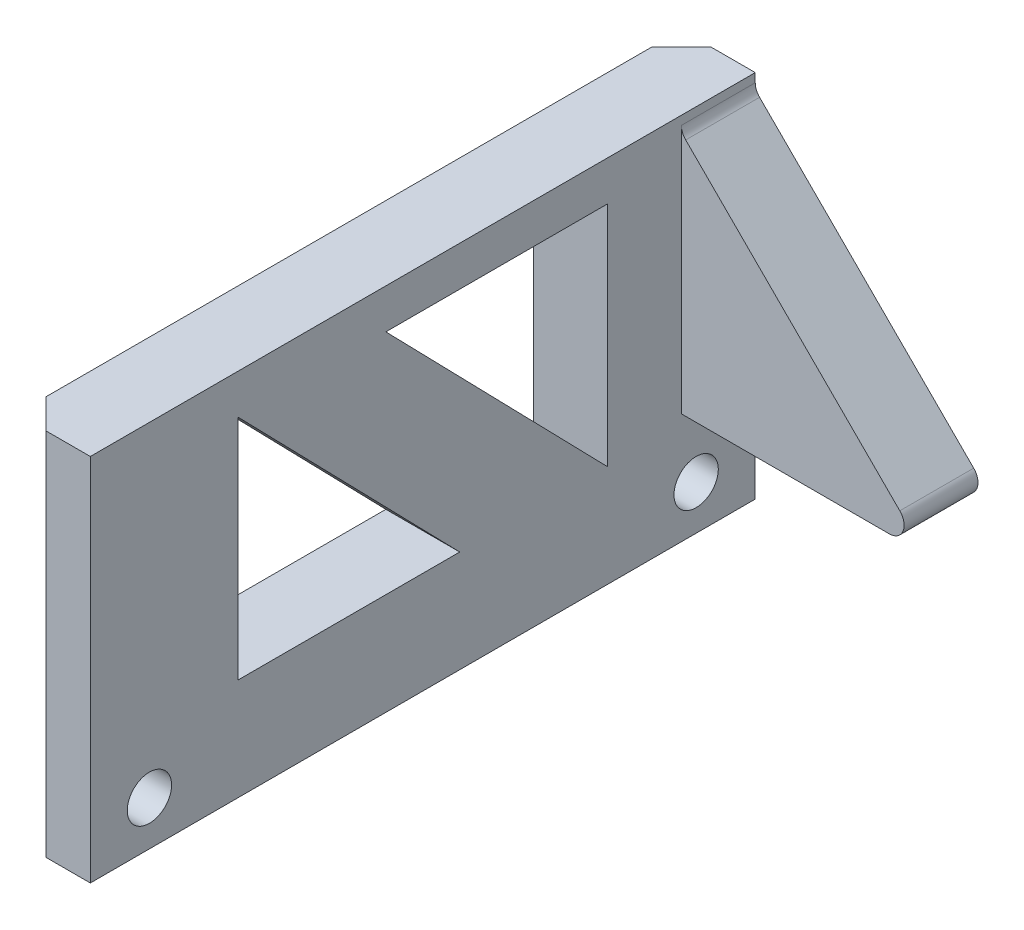
ISO-10303-21;
HEADER;
FILE_DESCRIPTION(('STEP AP214'),'2;1');
FILE_NAME('part.step','',(''),(''),'','','');
FILE_SCHEMA(('AUTOMOTIVE_DESIGN { 1 0 10303 214 1 1 1 1 }'));
ENDSEC;
DATA;
#1=APPLICATION_CONTEXT('core data for automotive mechanical design processes');
#2=APPLICATION_PROTOCOL_DEFINITION('international standard','automotive_design',2000,#1);
#3=PRODUCT_CONTEXT('',#1,'mechanical');
#4=PRODUCT('Part','Part','',(#3));
#5=PRODUCT_RELATED_PRODUCT_CATEGORY('part','',(#4));
#6=PRODUCT_DEFINITION_FORMATION('','',#4);
#7=PRODUCT_DEFINITION_CONTEXT('part definition',#1,'design');
#8=PRODUCT_DEFINITION('design','',#6,#7);
#9=PRODUCT_DEFINITION_SHAPE('','',#8);
#10=(LENGTH_UNIT() NAMED_UNIT(*) SI_UNIT(.MILLI.,.METRE.));
#11=(NAMED_UNIT(*) PLANE_ANGLE_UNIT() SI_UNIT($,.RADIAN.));
#12=(NAMED_UNIT(*) SI_UNIT($,.STERADIAN.) SOLID_ANGLE_UNIT());
#13=UNCERTAINTY_MEASURE_WITH_UNIT(LENGTH_MEASURE(1.E-05),#10,'distance_accuracy_value','');
#14=(GEOMETRIC_REPRESENTATION_CONTEXT(3) GLOBAL_UNCERTAINTY_ASSIGNED_CONTEXT((#13)) GLOBAL_UNIT_ASSIGNED_CONTEXT((#10,
#11,#12)) REPRESENTATION_CONTEXT('',''));
#15=CARTESIAN_POINT('',(0.,0.,0.));
#16=DIRECTION('',(0.,0.,1.));
#17=DIRECTION('',(1.,0.,0.));
#18=AXIS2_PLACEMENT_3D('',#15,#16,#17);
#19=CARTESIAN_POINT('',(5.,12.5,-22.5));
#20=DIRECTION('',(0.,0.,1.));
#21=DIRECTION('',(1.,0.,0.));
#22=AXIS2_PLACEMENT_3D('',#19,#20,#21);
#23=PLANE('',#22);
#24=DIRECTION('',(0.707106781186551,-0.707106781186544,0.));
#25=VECTOR('',#24,1.);
#26=CARTESIAN_POINT('',(21.4902925852937,-5.,-22.5));
#27=LINE('',#26,#25);
#28=CARTESIAN_POINT('',(5.29289321881346,11.1973993664801,-22.5));
#29=VERTEX_POINT('',#28);
#30=CARTESIAN_POINT('',(19.7831858041071,-3.29289321881345,-22.5));
#31=VERTEX_POINT('',#30);
#32=EDGE_CURVE('E356',#29,#31,#27,.T.);
#33=ORIENTED_EDGE('',*,*,#32,.T.);
#34=CARTESIAN_POINT('',(19.0760790229206,-4.,-22.5));
#35=DIRECTION('',(0.,0.,1.));
#36=DIRECTION('',(1.,0.,0.));
#37=AXIS2_PLACEMENT_3D('',#34,#35,#36);
#38=CIRCLE('',#37,1.);
#39=CARTESIAN_POINT('',(19.0760790229206,-5.,-22.5));
#40=VERTEX_POINT('',#39);
#41=EDGE_CURVE('E344',#31,#40,#38,.F.);
#42=ORIENTED_EDGE('',*,*,#41,.T.);
#43=DIRECTION('',(-1.,0.,0.));
#44=VECTOR('',#43,1.);
#45=CARTESIAN_POINT('',(5.,-5.,-22.5));
#46=LINE('',#45,#44);
#47=CARTESIAN_POINT('',(5.,-5.,-22.5));
#48=VERTEX_POINT('',#47);
#49=EDGE_CURVE('E181',#40,#48,#46,.T.);
#50=ORIENTED_EDGE('',*,*,#49,.T.);
#51=DIRECTION('',(0.,1.,0.));
#52=VECTOR('',#51,1.);
#53=CARTESIAN_POINT('',(5.,12.5,-22.5));
#54=LINE('',#53,#52);
#55=CARTESIAN_POINT('',(5.,-12.5,-22.5));
#56=VERTEX_POINT('',#55);
#57=EDGE_CURVE('E187',#56,#48,#54,.T.);
#58=ORIENTED_EDGE('',*,*,#57,.F.);
#59=DIRECTION('',(-1.,0.,0.));
#60=VECTOR('',#59,1.);
#61=CARTESIAN_POINT('',(5.,-12.5,-22.5));
#62=LINE('',#61,#60);
#63=CARTESIAN_POINT('',(2.,-12.5,-22.5));
#64=VERTEX_POINT('',#63);
#65=EDGE_CURVE('E290',#56,#64,#62,.T.);
#66=ORIENTED_EDGE('',*,*,#65,.T.);
#67=DIRECTION('',(0.,1.,0.));
#68=VECTOR('',#67,1.);
#69=CARTESIAN_POINT('',(2.,12.5,-22.5));
#70=LINE('',#69,#68);
#71=CARTESIAN_POINT('',(2.,12.5,-22.5));
#72=VERTEX_POINT('',#71);
#73=EDGE_CURVE('E335',#64,#72,#70,.T.);
#74=ORIENTED_EDGE('',*,*,#73,.T.);
#75=DIRECTION('',(-1.,0.,0.));
#76=VECTOR('',#75,1.);
#77=CARTESIAN_POINT('',(5.,12.5,-22.5));
#78=LINE('',#77,#76);
#79=CARTESIAN_POINT('',(5.,12.5,-22.5));
#80=VERTEX_POINT('',#79);
#81=EDGE_CURVE('E306',#80,#72,#78,.T.);
#82=ORIENTED_EDGE('',*,*,#81,.F.);
#83=CARTESIAN_POINT('',(5.,11.9045061476666,-22.5));
#84=VERTEX_POINT('',#83);
#85=EDGE_CURVE('E279',#84,#80,#54,.T.);
#86=ORIENTED_EDGE('',*,*,#85,.F.);
#87=CARTESIAN_POINT('',(6.,11.9045061476666,-22.5));
#88=DIRECTION('',(0.,0.,1.));
#89=DIRECTION('',(1.,0.,0.));
#90=AXIS2_PLACEMENT_3D('',#87,#88,#89);
#91=CIRCLE('',#90,1.);
#92=EDGE_CURVE('E57',#84,#29,#91,.T.);
#93=ORIENTED_EDGE('',*,*,#92,.T.);
#94=EDGE_LOOP('',(#33,#42,#50,#58,#66,#74,#82,#86,#93));
#95=FACE_BOUND('',#94,.T.);
#96=ADVANCED_FACE('F50',(#95),#23,.F.);
#97=CARTESIAN_POINT('',(5.,12.5,22.5));
#98=DIRECTION('',(0.,-1.,0.));
#99=DIRECTION('',(0.,0.,-1.));
#100=AXIS2_PLACEMENT_3D('',#97,#98,#99);
#101=PLANE('',#100);
#102=DIRECTION('',(0.,0.,1.));
#103=VECTOR('',#102,1.);
#104=CARTESIAN_POINT('',(0.,12.5,22.5));
#105=LINE('',#104,#103);
#106=CARTESIAN_POINT('',(0.,12.5,-20.5));
#107=VERTEX_POINT('',#106);
#108=CARTESIAN_POINT('',(0.,12.5,20.5));
#109=VERTEX_POINT('',#108);
#110=EDGE_CURVE('E263',#107,#109,#105,.T.);
#111=ORIENTED_EDGE('',*,*,#110,.T.);
#112=DIRECTION('',(-0.707106781186546,0.,-0.707106781186549));
#113=VECTOR('',#112,1.);
#114=CARTESIAN_POINT('',(2.,12.5,22.5));
#115=LINE('',#114,#113);
#116=CARTESIAN_POINT('',(2.,12.5,22.5));
#117=VERTEX_POINT('',#116);
#118=EDGE_CURVE('E329',#109,#117,#115,.F.);
#119=ORIENTED_EDGE('',*,*,#118,.T.);
#120=DIRECTION('',(-1.,0.,0.));
#121=VECTOR('',#120,1.);
#122=CARTESIAN_POINT('',(5.,12.5,22.5));
#123=LINE('',#122,#121);
#124=CARTESIAN_POINT('',(5.,12.5,22.5));
#125=VERTEX_POINT('',#124);
#126=EDGE_CURVE('E305',#125,#117,#123,.T.);
#127=ORIENTED_EDGE('',*,*,#126,.F.);
#128=DIRECTION('',(0.,0.,1.));
#129=VECTOR('',#128,1.);
#130=CARTESIAN_POINT('',(5.,12.5,22.5));
#131=LINE('',#130,#129);
#132=EDGE_CURVE('E280',#80,#125,#131,.T.);
#133=ORIENTED_EDGE('',*,*,#132,.F.);
#134=ORIENTED_EDGE('',*,*,#81,.T.);
#135=DIRECTION('',(0.707106781186546,0.,-0.707106781186549));
#136=VECTOR('',#135,1.);
#137=CARTESIAN_POINT('',(2.,12.5,-22.5));
#138=LINE('',#137,#136);
#139=EDGE_CURVE('E327',#72,#107,#138,.F.);
#140=ORIENTED_EDGE('',*,*,#139,.T.);
#141=EDGE_LOOP('',(#111,#119,#127,#133,#134,#140));
#142=FACE_BOUND('',#141,.T.);
#143=ADVANCED_FACE('F371',(#142),#101,.F.);
#144=CARTESIAN_POINT('',(5.,12.5,22.5));
#145=DIRECTION('',(0.,0.,-1.));
#146=DIRECTION('',(-1.,0.,0.));
#147=AXIS2_PLACEMENT_3D('',#144,#145,#146);
#148=PLANE('',#147);
#149=ORIENTED_EDGE('',*,*,#126,.T.);
#150=DIRECTION('',(0.,-1.,0.));
#151=VECTOR('',#150,1.);
#152=CARTESIAN_POINT('',(2.,12.5,22.5));
#153=LINE('',#152,#151);
#154=CARTESIAN_POINT('',(2.,-12.5,22.5));
#155=VERTEX_POINT('',#154);
#156=EDGE_CURVE('E309',#117,#155,#153,.T.);
#157=ORIENTED_EDGE('',*,*,#156,.T.);
#158=DIRECTION('',(-1.,0.,0.));
#159=VECTOR('',#158,1.);
#160=CARTESIAN_POINT('',(5.,-12.5,22.5));
#161=LINE('',#160,#159);
#162=CARTESIAN_POINT('',(5.,-12.5,22.5));
#163=VERTEX_POINT('',#162);
#164=EDGE_CURVE('E296',#163,#155,#161,.T.);
#165=ORIENTED_EDGE('',*,*,#164,.F.);
#166=DIRECTION('',(0.,-1.,0.));
#167=VECTOR('',#166,1.);
#168=CARTESIAN_POINT('',(5.,12.5,22.5));
#169=LINE('',#168,#167);
#170=EDGE_CURVE('E282',#125,#163,#169,.T.);
#171=ORIENTED_EDGE('',*,*,#170,.F.);
#172=EDGE_LOOP('',(#149,#157,#165,#171));
#173=FACE_BOUND('',#172,.T.);
#174=ADVANCED_FACE('F386',(#173),#148,.F.);
#175=CARTESIAN_POINT('',(5.,-12.5,22.5));
#176=DIRECTION('',(0.,1.,0.));
#177=DIRECTION('',(0.,0.,1.));
#178=AXIS2_PLACEMENT_3D('',#175,#176,#177);
#179=PLANE('',#178);
#180=ORIENTED_EDGE('',*,*,#164,.T.);
#181=DIRECTION('',(0.707106781186546,0.,0.707106781186549));
#182=VECTOR('',#181,1.);
#183=CARTESIAN_POINT('',(2.,-12.5,22.5));
#184=LINE('',#183,#182);
#185=CARTESIAN_POINT('',(0.,-12.5,20.5));
#186=VERTEX_POINT('',#185);
#187=EDGE_CURVE('E320',#155,#186,#184,.F.);
#188=ORIENTED_EDGE('',*,*,#187,.T.);
#189=DIRECTION('',(0.,0.,-1.));
#190=VECTOR('',#189,1.);
#191=CARTESIAN_POINT('',(0.,-12.5,22.5));
#192=LINE('',#191,#190);
#193=CARTESIAN_POINT('',(0.,-12.5,-20.5));
#194=VERTEX_POINT('',#193);
#195=EDGE_CURVE('E293',#186,#194,#192,.T.);
#196=ORIENTED_EDGE('',*,*,#195,.T.);
#197=DIRECTION('',(-0.707106781186546,0.,0.707106781186549));
#198=VECTOR('',#197,1.);
#199=CARTESIAN_POINT('',(2.,-12.5,-22.5));
#200=LINE('',#199,#198);
#201=EDGE_CURVE('E313',#194,#64,#200,.F.);
#202=ORIENTED_EDGE('',*,*,#201,.T.);
#203=ORIENTED_EDGE('',*,*,#65,.F.);
#204=DIRECTION('',(0.,0.,-1.));
#205=VECTOR('',#204,1.);
#206=CARTESIAN_POINT('',(5.,-12.5,22.5));
#207=LINE('',#206,#205);
#208=EDGE_CURVE('E284',#163,#56,#207,.T.);
#209=ORIENTED_EDGE('',*,*,#208,.F.);
#210=EDGE_LOOP('',(#180,#188,#196,#202,#203,#209));
#211=FACE_BOUND('',#210,.T.);
#212=ADVANCED_FACE('F393',(#211),#179,.F.);
#213=CARTESIAN_POINT('',(5.,0.,0.));
#214=DIRECTION('',(1.,0.,0.));
#215=DIRECTION('',(0.,0.,-1.));
#216=AXIS2_PLACEMENT_3D('',#213,#214,#215);
#217=PLANE('',#216);
#218=DIRECTION('',(0.,1.,0.));
#219=VECTOR('',#218,1.);
#220=CARTESIAN_POINT('',(5.,11.4902925852935,-17.5));
#221=LINE('',#220,#219);
#222=CARTESIAN_POINT('',(5.,-5.,-17.5));
#223=VERTEX_POINT('',#222);
#224=CARTESIAN_POINT('',(5.,11.9045061476666,-17.5));
#225=VERTEX_POINT('',#224);
#226=EDGE_CURVE('E64',#223,#225,#221,.T.);
#227=ORIENTED_EDGE('',*,*,#226,.T.);
#228=DIRECTION('',(0.,0.,-1.));
#229=VECTOR('',#228,1.);
#230=CARTESIAN_POINT('',(5.,11.9045061476666,-22.5));
#231=LINE('',#230,#229);
#232=EDGE_CURVE('E353',#225,#84,#231,.T.);
#233=ORIENTED_EDGE('',*,*,#232,.T.);
#234=ORIENTED_EDGE('',*,*,#85,.T.);
#235=ORIENTED_EDGE('',*,*,#132,.T.);
#236=ORIENTED_EDGE('',*,*,#170,.T.);
#237=ORIENTED_EDGE('',*,*,#208,.T.);
#238=ORIENTED_EDGE('',*,*,#57,.T.);
#239=DIRECTION('',(0.,0.,-1.));
#240=VECTOR('',#239,1.);
#241=CARTESIAN_POINT('',(5.,-5.,-17.5));
#242=LINE('',#241,#240);
#243=EDGE_CURVE('E169',#223,#48,#242,.T.);
#244=ORIENTED_EDGE('',*,*,#243,.F.);
#245=EDGE_LOOP('',(#227,#233,#234,#235,#236,#237,#238,#244));
#246=FACE_BOUND('',#245,.T.);
#247=DIRECTION('',(0.,-0.716418791651359,-0.697670491685585));
#248=VECTOR('',#247,1.);
#249=CARTESIAN_POINT('',(5.,-5.59947650810714,-12.5));
#250=LINE('',#249,#248);
#251=CARTESIAN_POINT('',(5.,9.80361420998697,2.5));
#252=VERTEX_POINT('',#251);
#253=CARTESIAN_POINT('',(5.,-5.59947650810714,-12.5));
#254=VERTEX_POINT('',#253);
#255=EDGE_CURVE('E211',#252,#254,#250,.T.);
#256=ORIENTED_EDGE('',*,*,#255,.F.);
#257=DIRECTION('',(0.,0.,1.));
#258=VECTOR('',#257,1.);
#259=CARTESIAN_POINT('',(5.,9.80361420998697,2.5));
#260=LINE('',#259,#258);
#261=CARTESIAN_POINT('',(5.,9.80361420998697,-12.5));
#262=VERTEX_POINT('',#261);
#263=EDGE_CURVE('E204',#262,#252,#260,.T.);
#264=ORIENTED_EDGE('',*,*,#263,.F.);
#265=DIRECTION('',(0.,1.,0.));
#266=VECTOR('',#265,1.);
#267=CARTESIAN_POINT('',(5.,9.80361420998697,-12.5));
#268=LINE('',#267,#266);
#269=EDGE_CURVE('E209',#254,#262,#268,.T.);
#270=ORIENTED_EDGE('',*,*,#269,.F.);
#271=EDGE_LOOP('',(#256,#264,#270));
#272=FACE_BOUND('',#271,.T.);
#273=DIRECTION('',(0.,0.716418791651359,0.697670491685585));
#274=VECTOR('',#273,1.);
#275=CARTESIAN_POINT('',(5.,-5.59947650810714,-2.5));
#276=LINE('',#275,#274);
#277=CARTESIAN_POINT('',(5.,-5.59947650810714,-2.5));
#278=VERTEX_POINT('',#277);
#279=CARTESIAN_POINT('',(5.,9.80361420998697,12.5));
#280=VERTEX_POINT('',#279);
#281=EDGE_CURVE('E220',#278,#280,#276,.T.);
#282=ORIENTED_EDGE('',*,*,#281,.F.);
#283=DIRECTION('',(0.,0.,-1.));
#284=VECTOR('',#283,1.);
#285=CARTESIAN_POINT('',(5.,-5.59947650810714,12.5));
#286=LINE('',#285,#284);
#287=CARTESIAN_POINT('',(5.,-5.59947650810714,12.5));
#288=VERTEX_POINT('',#287);
#289=EDGE_CURVE('E231',#288,#278,#286,.T.);
#290=ORIENTED_EDGE('',*,*,#289,.F.);
#291=DIRECTION('',(0.,-1.,0.));
#292=VECTOR('',#291,1.);
#293=CARTESIAN_POINT('',(5.,9.80361420998697,12.5));
#294=LINE('',#293,#292);
#295=EDGE_CURVE('E243',#280,#288,#294,.T.);
#296=ORIENTED_EDGE('',*,*,#295,.F.);
#297=EDGE_LOOP('',(#282,#290,#296));
#298=FACE_BOUND('',#297,.T.);
#299=CARTESIAN_POINT('',(5.,-9.5,18.5));
#300=DIRECTION('',(1.,0.,0.));
#301=DIRECTION('',(0.,0.,-1.));
#302=AXIS2_PLACEMENT_3D('',#299,#300,#301);
#303=CIRCLE('',#302,1.5);
#304=CARTESIAN_POINT('',(5.,-9.5,17.));
#305=VERTEX_POINT('',#304);
#306=EDGE_CURVE('E264',#305,#305,#303,.T.);
#307=ORIENTED_EDGE('',*,*,#306,.F.);
#308=EDGE_LOOP('',(#307));
#309=FACE_BOUND('',#308,.T.);
#310=CARTESIAN_POINT('',(5.,-9.5,-18.5));
#311=DIRECTION('',(1.,0.,0.));
#312=DIRECTION('',(0.,0.,-1.));
#313=AXIS2_PLACEMENT_3D('',#310,#311,#312);
#314=CIRCLE('',#313,1.5);
#315=CARTESIAN_POINT('',(5.,-9.5,-20.));
#316=VERTEX_POINT('',#315);
#317=EDGE_CURVE('E266',#316,#316,#314,.T.);
#318=ORIENTED_EDGE('',*,*,#317,.F.);
#319=EDGE_LOOP('',(#318));
#320=FACE_BOUND('',#319,.T.);
#321=ADVANCED_FACE('F182',(#246,#272,#298,#309,#320),#217,.T.);
#322=CARTESIAN_POINT('',(0.,0.,0.));
#323=DIRECTION('',(1.,0.,0.));
#324=DIRECTION('',(0.,0.,-1.));
#325=AXIS2_PLACEMENT_3D('',#322,#323,#324);
#326=PLANE('',#325);
#327=DIRECTION('',(0.,0.,1.));
#328=VECTOR('',#327,1.);
#329=CARTESIAN_POINT('',(0.,9.80361420998697,2.5));
#330=LINE('',#329,#328);
#331=CARTESIAN_POINT('',(0.,9.80361420998697,-12.5));
#332=VERTEX_POINT('',#331);
#333=CARTESIAN_POINT('',(0.,9.80361420998697,2.5));
#334=VERTEX_POINT('',#333);
#335=EDGE_CURVE('E205',#332,#334,#330,.T.);
#336=ORIENTED_EDGE('',*,*,#335,.T.);
#337=DIRECTION('',(0.,-0.716418791651359,-0.697670491685585));
#338=VECTOR('',#337,1.);
#339=CARTESIAN_POINT('',(0.,-5.59947650810714,-12.5));
#340=LINE('',#339,#338);
#341=CARTESIAN_POINT('',(0.,-5.59947650810714,-12.5));
#342=VERTEX_POINT('',#341);
#343=EDGE_CURVE('E208',#334,#342,#340,.T.);
#344=ORIENTED_EDGE('',*,*,#343,.T.);
#345=DIRECTION('',(0.,1.,0.));
#346=VECTOR('',#345,1.);
#347=CARTESIAN_POINT('',(0.,9.80361420998697,-12.5));
#348=LINE('',#347,#346);
#349=EDGE_CURVE('E223',#342,#332,#348,.T.);
#350=ORIENTED_EDGE('',*,*,#349,.T.);
#351=EDGE_LOOP('',(#336,#344,#350));
#352=FACE_BOUND('',#351,.T.);
#353=DIRECTION('',(0.,0.,-1.));
#354=VECTOR('',#353,1.);
#355=CARTESIAN_POINT('',(0.,-5.59947650810714,12.5));
#356=LINE('',#355,#354);
#357=CARTESIAN_POINT('',(0.,-5.59947650810714,12.5));
#358=VERTEX_POINT('',#357);
#359=CARTESIAN_POINT('',(0.,-5.59947650810714,-2.5));
#360=VERTEX_POINT('',#359);
#361=EDGE_CURVE('E236',#358,#360,#356,.T.);
#362=ORIENTED_EDGE('',*,*,#361,.T.);
#363=DIRECTION('',(0.,0.716418791651359,0.697670491685585));
#364=VECTOR('',#363,1.);
#365=CARTESIAN_POINT('',(0.,-5.59947650810714,-2.5));
#366=LINE('',#365,#364);
#367=CARTESIAN_POINT('',(0.,9.80361420998697,12.5));
#368=VERTEX_POINT('',#367);
#369=EDGE_CURVE('E226',#360,#368,#366,.T.);
#370=ORIENTED_EDGE('',*,*,#369,.T.);
#371=DIRECTION('',(0.,-1.,0.));
#372=VECTOR('',#371,1.);
#373=CARTESIAN_POINT('',(0.,9.80361420998697,12.5));
#374=LINE('',#373,#372);
#375=EDGE_CURVE('E235',#368,#358,#374,.T.);
#376=ORIENTED_EDGE('',*,*,#375,.T.);
#377=EDGE_LOOP('',(#362,#370,#376));
#378=FACE_BOUND('',#377,.T.);
#379=CARTESIAN_POINT('',(0.,-9.5,18.5));
#380=DIRECTION('',(1.,0.,0.));
#381=DIRECTION('',(0.,0.,-1.));
#382=AXIS2_PLACEMENT_3D('',#379,#380,#381);
#383=CIRCLE('',#382,1.5);
#384=CARTESIAN_POINT('',(0.,-9.5,17.));
#385=VERTEX_POINT('',#384);
#386=EDGE_CURVE('E256',#385,#385,#383,.T.);
#387=ORIENTED_EDGE('',*,*,#386,.T.);
#388=EDGE_LOOP('',(#387));
#389=FACE_BOUND('',#388,.T.);
#390=CARTESIAN_POINT('',(0.,-9.5,-18.5));
#391=DIRECTION('',(1.,0.,0.));
#392=DIRECTION('',(0.,0.,-1.));
#393=AXIS2_PLACEMENT_3D('',#390,#391,#392);
#394=CIRCLE('',#393,1.5);
#395=CARTESIAN_POINT('',(0.,-9.5,-20.));
#396=VERTEX_POINT('',#395);
#397=EDGE_CURVE('E254',#396,#396,#394,.T.);
#398=ORIENTED_EDGE('',*,*,#397,.T.);
#399=EDGE_LOOP('',(#398));
#400=FACE_BOUND('',#399,.T.);
#401=ORIENTED_EDGE('',*,*,#195,.F.);
#402=DIRECTION('',(0.,1.,0.));
#403=VECTOR('',#402,1.);
#404=CARTESIAN_POINT('',(0.,0.,20.5));
#405=LINE('',#404,#403);
#406=EDGE_CURVE('E324',#186,#109,#405,.T.);
#407=ORIENTED_EDGE('',*,*,#406,.T.);
#408=ORIENTED_EDGE('',*,*,#110,.F.);
#409=DIRECTION('',(0.,-1.,0.));
#410=VECTOR('',#409,1.);
#411=CARTESIAN_POINT('',(0.,0.,-20.5));
#412=LINE('',#411,#410);
#413=EDGE_CURVE('E318',#107,#194,#412,.T.);
#414=ORIENTED_EDGE('',*,*,#413,.T.);
#415=EDGE_LOOP('',(#401,#407,#408,#414));
#416=FACE_BOUND('',#415,.T.);
#417=ADVANCED_FACE('F384',(#352,#378,#389,#400,#416),#326,.F.);
#418=CARTESIAN_POINT('',(0.,-9.5,-18.5));
#419=DIRECTION('',(1.,0.,0.));
#420=DIRECTION('',(0.,0.,-1.));
#421=AXIS2_PLACEMENT_3D('',#418,#419,#420);
#422=CYLINDRICAL_SURFACE('',#421,1.5);
#423=ORIENTED_EDGE('',*,*,#397,.F.);
#424=EDGE_LOOP('',(#423));
#425=FACE_BOUND('',#424,.T.);
#426=ORIENTED_EDGE('',*,*,#317,.T.);
#427=EDGE_LOOP('',(#426));
#428=FACE_BOUND('',#427,.T.);
#429=ADVANCED_FACE('F453',(#425,#428),#422,.F.);
#430=CARTESIAN_POINT('',(0.,-9.5,18.5));
#431=DIRECTION('',(1.,0.,0.));
#432=DIRECTION('',(0.,0.,-1.));
#433=AXIS2_PLACEMENT_3D('',#430,#431,#432);
#434=CYLINDRICAL_SURFACE('',#433,1.5);
#435=ORIENTED_EDGE('',*,*,#386,.F.);
#436=EDGE_LOOP('',(#435));
#437=FACE_BOUND('',#436,.T.);
#438=ORIENTED_EDGE('',*,*,#306,.T.);
#439=EDGE_LOOP('',(#438));
#440=FACE_BOUND('',#439,.T.);
#441=ADVANCED_FACE('F452',(#437,#440),#434,.F.);
#442=CARTESIAN_POINT('',(0.,-5.59947650810714,-2.5));
#443=DIRECTION('',(0.,0.697670491685585,-0.716418791651359));
#444=DIRECTION('',(0.,0.716418791651359,0.697670491685585));
#445=AXIS2_PLACEMENT_3D('',#442,#443,#444);
#446=PLANE('',#445);
#447=ORIENTED_EDGE('',*,*,#281,.T.);
#448=DIRECTION('',(1.,0.,0.));
#449=VECTOR('',#448,1.);
#450=CARTESIAN_POINT('',(0.,9.80361420998697,12.5));
#451=LINE('',#450,#449);
#452=EDGE_CURVE('E239',#368,#280,#451,.T.);
#453=ORIENTED_EDGE('',*,*,#452,.F.);
#454=ORIENTED_EDGE('',*,*,#369,.F.);
#455=DIRECTION('',(1.,0.,0.));
#456=VECTOR('',#455,1.);
#457=CARTESIAN_POINT('',(0.,-5.59947650810714,-2.5));
#458=LINE('',#457,#456);
#459=EDGE_CURVE('E249',#360,#278,#458,.T.);
#460=ORIENTED_EDGE('',*,*,#459,.T.);
#461=EDGE_LOOP('',(#447,#453,#454,#460));
#462=FACE_BOUND('',#461,.T.);
#463=ADVANCED_FACE('F443',(#462),#446,.F.);
#464=CARTESIAN_POINT('',(0.,-5.59947650810714,12.5));
#465=DIRECTION('',(0.,-1.,0.));
#466=DIRECTION('',(0.,0.,-1.));
#467=AXIS2_PLACEMENT_3D('',#464,#465,#466);
#468=PLANE('',#467);
#469=ORIENTED_EDGE('',*,*,#289,.T.);
#470=ORIENTED_EDGE('',*,*,#459,.F.);
#471=ORIENTED_EDGE('',*,*,#361,.F.);
#472=DIRECTION('',(1.,0.,0.));
#473=VECTOR('',#472,1.);
#474=CARTESIAN_POINT('',(0.,-5.59947650810714,12.5));
#475=LINE('',#474,#473);
#476=EDGE_CURVE('E251',#358,#288,#475,.T.);
#477=ORIENTED_EDGE('',*,*,#476,.T.);
#478=EDGE_LOOP('',(#469,#470,#471,#477));
#479=FACE_BOUND('',#478,.T.);
#480=ADVANCED_FACE('F441',(#479),#468,.F.);
#481=CARTESIAN_POINT('',(0.,9.80361420998697,12.5));
#482=DIRECTION('',(0.,0.,1.));
#483=DIRECTION('',(1.,0.,0.));
#484=AXIS2_PLACEMENT_3D('',#481,#482,#483);
#485=PLANE('',#484);
#486=ORIENTED_EDGE('',*,*,#295,.T.);
#487=ORIENTED_EDGE('',*,*,#476,.F.);
#488=ORIENTED_EDGE('',*,*,#375,.F.);
#489=ORIENTED_EDGE('',*,*,#452,.T.);
#490=EDGE_LOOP('',(#486,#487,#488,#489));
#491=FACE_BOUND('',#490,.T.);
#492=ADVANCED_FACE('F433',(#491),#485,.F.);
#493=CARTESIAN_POINT('',(0.,-5.59947650810714,-12.5));
#494=DIRECTION('',(0.,-0.697670491685585,0.716418791651359));
#495=DIRECTION('',(0.,-0.716418791651359,-0.697670491685585));
#496=AXIS2_PLACEMENT_3D('',#493,#494,#495);
#497=PLANE('',#496);
#498=ORIENTED_EDGE('',*,*,#255,.T.);
#499=DIRECTION('',(1.,0.,0.));
#500=VECTOR('',#499,1.);
#501=CARTESIAN_POINT('',(0.,-5.59947650810714,-12.5));
#502=LINE('',#501,#500);
#503=EDGE_CURVE('E198',#342,#254,#502,.T.);
#504=ORIENTED_EDGE('',*,*,#503,.F.);
#505=ORIENTED_EDGE('',*,*,#343,.F.);
#506=DIRECTION('',(1.,0.,0.));
#507=VECTOR('',#506,1.);
#508=CARTESIAN_POINT('',(0.,9.80361420998697,2.5));
#509=LINE('',#508,#507);
#510=EDGE_CURVE('E189',#334,#252,#509,.T.);
#511=ORIENTED_EDGE('',*,*,#510,.T.);
#512=EDGE_LOOP('',(#498,#504,#505,#511));
#513=FACE_BOUND('',#512,.T.);
#514=ADVANCED_FACE('F429',(#513),#497,.F.);
#515=CARTESIAN_POINT('',(0.,9.80361420998697,2.5));
#516=DIRECTION('',(0.,1.,0.));
#517=DIRECTION('',(0.,0.,1.));
#518=AXIS2_PLACEMENT_3D('',#515,#516,#517);
#519=PLANE('',#518);
#520=ORIENTED_EDGE('',*,*,#263,.T.);
#521=ORIENTED_EDGE('',*,*,#510,.F.);
#522=ORIENTED_EDGE('',*,*,#335,.F.);
#523=DIRECTION('',(1.,0.,0.));
#524=VECTOR('',#523,1.);
#525=CARTESIAN_POINT('',(0.,9.80361420998697,-12.5));
#526=LINE('',#525,#524);
#527=EDGE_CURVE('E194',#332,#262,#526,.T.);
#528=ORIENTED_EDGE('',*,*,#527,.T.);
#529=EDGE_LOOP('',(#520,#521,#522,#528));
#530=FACE_BOUND('',#529,.T.);
#531=ADVANCED_FACE('F435',(#530),#519,.F.);
#532=CARTESIAN_POINT('',(0.,9.80361420998697,-12.5));
#533=DIRECTION('',(0.,0.,-1.));
#534=DIRECTION('',(0.,1.,0.));
#535=AXIS2_PLACEMENT_3D('',#532,#533,#534);
#536=PLANE('',#535);
#537=ORIENTED_EDGE('',*,*,#269,.T.);
#538=ORIENTED_EDGE('',*,*,#527,.F.);
#539=ORIENTED_EDGE('',*,*,#349,.F.);
#540=ORIENTED_EDGE('',*,*,#503,.T.);
#541=EDGE_LOOP('',(#537,#538,#539,#540));
#542=FACE_BOUND('',#541,.T.);
#543=ADVANCED_FACE('F416',(#542),#536,.F.);
#544=CARTESIAN_POINT('',(2.,12.5,22.5));
#545=DIRECTION('',(0.707106781186549,0.,-0.707106781186546));
#546=DIRECTION('',(0.,-1.,0.));
#547=AXIS2_PLACEMENT_3D('',#544,#545,#546);
#548=PLANE('',#547);
#549=ORIENTED_EDGE('',*,*,#118,.F.);
#550=ORIENTED_EDGE('',*,*,#406,.F.);
#551=ORIENTED_EDGE('',*,*,#187,.F.);
#552=ORIENTED_EDGE('',*,*,#156,.F.);
#553=EDGE_LOOP('',(#549,#550,#551,#552));
#554=FACE_BOUND('',#553,.T.);
#555=ADVANCED_FACE('F387',(#554),#548,.F.);
#556=CARTESIAN_POINT('',(2.,12.5,-22.5));
#557=DIRECTION('',(0.707106781186549,0.,0.707106781186546));
#558=DIRECTION('',(0.,1.,0.));
#559=AXIS2_PLACEMENT_3D('',#556,#557,#558);
#560=PLANE('',#559);
#561=ORIENTED_EDGE('',*,*,#201,.F.);
#562=ORIENTED_EDGE('',*,*,#413,.F.);
#563=ORIENTED_EDGE('',*,*,#139,.F.);
#564=ORIENTED_EDGE('',*,*,#73,.F.);
#565=EDGE_LOOP('',(#561,#562,#563,#564));
#566=FACE_BOUND('',#565,.T.);
#567=ADVANCED_FACE('F380',(#566),#560,.F.);
#568=CARTESIAN_POINT('',(5.,-5.,-17.5));
#569=DIRECTION('',(0.,-1.,0.));
#570=DIRECTION('',(1.,0.,0.));
#571=AXIS2_PLACEMENT_3D('',#568,#569,#570);
#572=PLANE('',#571);
#573=ORIENTED_EDGE('',*,*,#49,.F.);
#574=DIRECTION('',(0.,0.,-1.));
#575=VECTOR('',#574,1.);
#576=CARTESIAN_POINT('',(19.0760790229206,-5.,-17.5));
#577=LINE('',#576,#575);
#578=CARTESIAN_POINT('',(19.0760790229206,-5.,-17.5));
#579=VERTEX_POINT('',#578);
#580=EDGE_CURVE('E66',#40,#579,#577,.F.);
#581=ORIENTED_EDGE('',*,*,#580,.T.);
#582=DIRECTION('',(-1.,0.,0.));
#583=VECTOR('',#582,1.);
#584=CARTESIAN_POINT('',(5.,-5.,-17.5));
#585=LINE('',#584,#583);
#586=EDGE_CURVE('E170',#579,#223,#585,.T.);
#587=ORIENTED_EDGE('',*,*,#586,.T.);
#588=ORIENTED_EDGE('',*,*,#243,.T.);
#589=EDGE_LOOP('',(#573,#581,#587,#588));
#590=FACE_BOUND('',#589,.T.);
#591=ADVANCED_FACE('F166',(#590),#572,.T.);
#592=CARTESIAN_POINT('',(21.4902925852937,-5.,-17.5));
#593=DIRECTION('',(0.707106781186544,0.707106781186551,0.));
#594=DIRECTION('',(-0.707106781186551,0.707106781186544,0.));
#595=AXIS2_PLACEMENT_3D('',#592,#593,#594);
#596=PLANE('',#595);
#597=DIRECTION('',(0.707106781186551,-0.707106781186544,0.));
#598=VECTOR('',#597,1.);
#599=CARTESIAN_POINT('',(21.4902925852937,-5.,-17.5));
#600=LINE('',#599,#598);
#601=CARTESIAN_POINT('',(5.29289321881346,11.1973993664801,-17.5));
#602=VERTEX_POINT('',#601);
#603=CARTESIAN_POINT('',(19.7831858041071,-3.29289321881345,-17.5));
#604=VERTEX_POINT('',#603);
#605=EDGE_CURVE('E172',#602,#604,#600,.T.);
#606=ORIENTED_EDGE('',*,*,#605,.T.);
#607=DIRECTION('',(0.,0.,-1.));
#608=VECTOR('',#607,1.);
#609=CARTESIAN_POINT('',(19.7831858041071,-3.29289321881345,-17.5));
#610=LINE('',#609,#608);
#611=EDGE_CURVE('E339',#604,#31,#610,.T.);
#612=ORIENTED_EDGE('',*,*,#611,.T.);
#613=ORIENTED_EDGE('',*,*,#32,.F.);
#614=DIRECTION('',(0.,0.,-1.));
#615=VECTOR('',#614,1.);
#616=CARTESIAN_POINT('',(5.29289321881346,11.1973993664801,-17.5));
#617=LINE('',#616,#615);
#618=EDGE_CURVE('E337',#29,#602,#617,.F.);
#619=ORIENTED_EDGE('',*,*,#618,.T.);
#620=EDGE_LOOP('',(#606,#612,#613,#619));
#621=FACE_BOUND('',#620,.T.);
#622=ADVANCED_FACE('F364',(#621),#596,.T.);
#623=CARTESIAN_POINT('',(0.,0.,-17.5));
#624=DIRECTION('',(0.,0.,1.));
#625=DIRECTION('',(1.,0.,0.));
#626=AXIS2_PLACEMENT_3D('',#623,#624,#625);
#627=PLANE('',#626);
#628=ORIENTED_EDGE('',*,*,#586,.F.);
#629=CARTESIAN_POINT('',(19.0760790229206,-4.,-17.5));
#630=DIRECTION('',(0.,0.,1.));
#631=DIRECTION('',(1.,0.,0.));
#632=AXIS2_PLACEMENT_3D('',#629,#630,#631);
#633=CIRCLE('',#632,1.);
#634=EDGE_CURVE('E348',#579,#604,#633,.T.);
#635=ORIENTED_EDGE('',*,*,#634,.T.);
#636=ORIENTED_EDGE('',*,*,#605,.F.);
#637=CARTESIAN_POINT('',(6.,11.9045061476666,-17.5));
#638=DIRECTION('',(0.,0.,1.));
#639=DIRECTION('',(1.,0.,0.));
#640=AXIS2_PLACEMENT_3D('',#637,#638,#639);
#641=CIRCLE('',#640,1.);
#642=EDGE_CURVE('E11',#602,#225,#641,.F.);
#643=ORIENTED_EDGE('',*,*,#642,.T.);
#644=ORIENTED_EDGE('',*,*,#226,.F.);
#645=EDGE_LOOP('',(#628,#635,#636,#643,#644));
#646=FACE_BOUND('',#645,.T.);
#647=ADVANCED_FACE('F176',(#646),#627,.T.);
#648=CARTESIAN_POINT('',(19.0760790229206,-4.,-17.5));
#649=DIRECTION('',(0.,0.,-1.));
#650=DIRECTION('',(-1.,0.,0.));
#651=AXIS2_PLACEMENT_3D('',#648,#649,#650);
#652=CYLINDRICAL_SURFACE('',#651,1.);
#653=ORIENTED_EDGE('',*,*,#634,.F.);
#654=ORIENTED_EDGE('',*,*,#580,.F.);
#655=ORIENTED_EDGE('',*,*,#41,.F.);
#656=ORIENTED_EDGE('',*,*,#611,.F.);
#657=EDGE_LOOP('',(#653,#654,#655,#656));
#658=FACE_BOUND('',#657,.T.);
#659=ADVANCED_FACE('F397',(#658),#652,.T.);
#660=CARTESIAN_POINT('',(6.,11.9045061476666,0.));
#661=DIRECTION('',(0.,0.,1.));
#662=DIRECTION('',(1.,0.,0.));
#663=AXIS2_PLACEMENT_3D('',#660,#661,#662);
#664=CYLINDRICAL_SURFACE('',#663,1.);
#665=ORIENTED_EDGE('',*,*,#642,.F.);
#666=ORIENTED_EDGE('',*,*,#618,.F.);
#667=ORIENTED_EDGE('',*,*,#92,.F.);
#668=ORIENTED_EDGE('',*,*,#232,.F.);
#669=EDGE_LOOP('',(#665,#666,#667,#668));
#670=FACE_BOUND('',#669,.T.);
#671=ADVANCED_FACE('F47',(#670),#664,.F.);
#672=CLOSED_SHELL('',(#96,#143,#174,#212,#321,#417,#429,#441,#463,#480,#492,#514,#531,#543,#555,
#567,#591,#622,#647,#659,#671));
#673=MANIFOLD_SOLID_BREP('B2',#672);
#674=ADVANCED_BREP_SHAPE_REPRESENTATION('',(#18,#673),#14);
#675=SHAPE_DEFINITION_REPRESENTATION(#9,#674);
ENDSEC;
END-ISO-10303-21;
